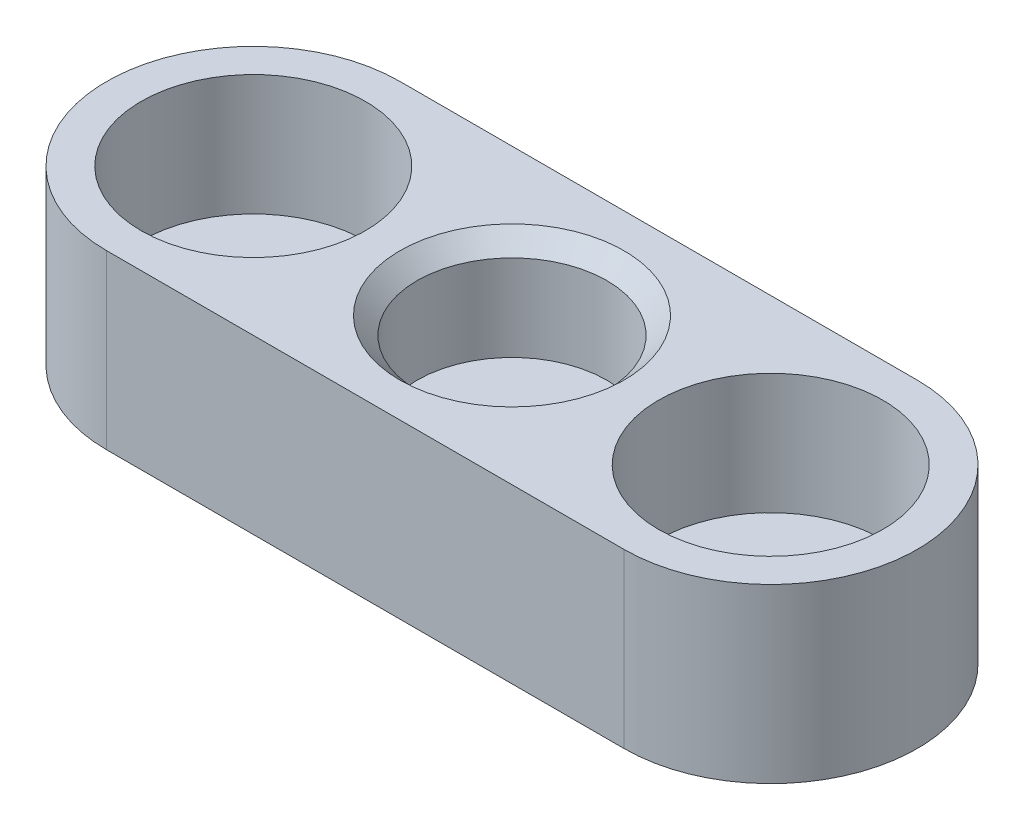
ISO-10303-21;
HEADER;
FILE_DESCRIPTION(('STEP AP214'),'2;1');
FILE_NAME('part.step','',(''),(''),'','','');
FILE_SCHEMA(('AUTOMOTIVE_DESIGN { 1 0 10303 214 1 1 1 1 }'));
ENDSEC;
DATA;
#1=APPLICATION_CONTEXT('core data for automotive mechanical design processes');
#2=APPLICATION_PROTOCOL_DEFINITION('international standard','automotive_design',2000,#1);
#3=PRODUCT_CONTEXT('',#1,'mechanical');
#4=PRODUCT('Part','Part','',(#3));
#5=PRODUCT_RELATED_PRODUCT_CATEGORY('part','',(#4));
#6=PRODUCT_DEFINITION_FORMATION('','',#4);
#7=PRODUCT_DEFINITION_CONTEXT('part definition',#1,'design');
#8=PRODUCT_DEFINITION('design','',#6,#7);
#9=PRODUCT_DEFINITION_SHAPE('','',#8);
#10=(LENGTH_UNIT() NAMED_UNIT(*) SI_UNIT(.MILLI.,.METRE.));
#11=(NAMED_UNIT(*) PLANE_ANGLE_UNIT() SI_UNIT($,.RADIAN.));
#12=(NAMED_UNIT(*) SI_UNIT($,.STERADIAN.) SOLID_ANGLE_UNIT());
#13=UNCERTAINTY_MEASURE_WITH_UNIT(LENGTH_MEASURE(1.E-05),#10,'distance_accuracy_value','');
#14=(GEOMETRIC_REPRESENTATION_CONTEXT(3) GLOBAL_UNCERTAINTY_ASSIGNED_CONTEXT((#13)) GLOBAL_UNIT_ASSIGNED_CONTEXT((#10,
#11,#12)) REPRESENTATION_CONTEXT('',''));
#15=CARTESIAN_POINT('',(0.,0.,0.));
#16=DIRECTION('',(0.,0.,1.));
#17=DIRECTION('',(1.,0.,0.));
#18=AXIS2_PLACEMENT_3D('',#15,#16,#17);
#19=CARTESIAN_POINT('',(7.5,5.,0.));
#20=DIRECTION('',(0.,-1.,0.));
#21=DIRECTION('',(0.,0.,-1.));
#22=AXIS2_PLACEMENT_3D('',#19,#20,#21);
#23=CYLINDRICAL_SURFACE('',#22,4.25);
#24=CARTESIAN_POINT('',(7.5,0.,0.));
#25=DIRECTION('',(0.,1.,0.));
#26=DIRECTION('',(0.,0.,1.));
#27=AXIS2_PLACEMENT_3D('',#24,#25,#26);
#28=CIRCLE('',#27,4.25);
#29=CARTESIAN_POINT('',(7.5,0.,4.25));
#30=VERTEX_POINT('',#29);
#31=CARTESIAN_POINT('',(7.5,0.,-4.25000000000001));
#32=VERTEX_POINT('',#31);
#33=EDGE_CURVE('E128',#30,#32,#28,.T.);
#34=ORIENTED_EDGE('',*,*,#33,.T.);
#35=DIRECTION('',(0.,-1.,0.));
#36=VECTOR('',#35,1.);
#37=CARTESIAN_POINT('',(7.5,5.,-4.25000000000001));
#38=LINE('',#37,#36);
#39=CARTESIAN_POINT('',(7.5,5.,-4.25000000000001));
#40=VERTEX_POINT('',#39);
#41=EDGE_CURVE('E114',#40,#32,#38,.T.);
#42=ORIENTED_EDGE('',*,*,#41,.F.);
#43=CARTESIAN_POINT('',(7.5,5.,0.));
#44=DIRECTION('',(0.,1.,0.));
#45=DIRECTION('',(0.,0.,1.));
#46=AXIS2_PLACEMENT_3D('',#43,#44,#45);
#47=CIRCLE('',#46,4.25);
#48=CARTESIAN_POINT('',(7.5,5.,4.25));
#49=VERTEX_POINT('',#48);
#50=EDGE_CURVE('E106',#49,#40,#47,.T.);
#51=ORIENTED_EDGE('',*,*,#50,.F.);
#52=DIRECTION('',(0.,-1.,0.));
#53=VECTOR('',#52,1.);
#54=CARTESIAN_POINT('',(7.5,5.,4.25));
#55=LINE('',#54,#53);
#56=EDGE_CURVE('E124',#49,#30,#55,.T.);
#57=ORIENTED_EDGE('',*,*,#56,.T.);
#58=EDGE_LOOP('',(#34,#42,#51,#57));
#59=FACE_BOUND('',#58,.T.);
#60=ADVANCED_FACE('F47',(#59),#23,.T.);
#61=CARTESIAN_POINT('',(-7.5,5.,-4.25));
#62=DIRECTION('',(0.,0.,1.));
#63=DIRECTION('',(1.,0.,0.));
#64=AXIS2_PLACEMENT_3D('',#61,#62,#63);
#65=PLANE('',#64);
#66=DIRECTION('',(-1.,0.,0.));
#67=VECTOR('',#66,1.);
#68=CARTESIAN_POINT('',(-7.5,0.,-4.25));
#69=LINE('',#68,#67);
#70=CARTESIAN_POINT('',(-7.5,0.,-4.25));
#71=VERTEX_POINT('',#70);
#72=EDGE_CURVE('E112',#32,#71,#69,.T.);
#73=ORIENTED_EDGE('',*,*,#72,.T.);
#74=DIRECTION('',(0.,-1.,0.));
#75=VECTOR('',#74,1.);
#76=CARTESIAN_POINT('',(-7.5,5.,-4.25));
#77=LINE('',#76,#75);
#78=CARTESIAN_POINT('',(-7.5,5.,-4.25));
#79=VERTEX_POINT('',#78);
#80=EDGE_CURVE('E110',#79,#71,#77,.T.);
#81=ORIENTED_EDGE('',*,*,#80,.F.);
#82=DIRECTION('',(-1.,0.,0.));
#83=VECTOR('',#82,1.);
#84=CARTESIAN_POINT('',(-7.5,5.,-4.25));
#85=LINE('',#84,#83);
#86=EDGE_CURVE('E101',#40,#79,#85,.T.);
#87=ORIENTED_EDGE('',*,*,#86,.F.);
#88=ORIENTED_EDGE('',*,*,#41,.T.);
#89=EDGE_LOOP('',(#73,#81,#87,#88));
#90=FACE_BOUND('',#89,.T.);
#91=ADVANCED_FACE('F111',(#90),#65,.F.);
#92=CARTESIAN_POINT('',(-7.5,5.,0.));
#93=DIRECTION('',(0.,-1.,0.));
#94=DIRECTION('',(0.,0.,-1.));
#95=AXIS2_PLACEMENT_3D('',#92,#93,#94);
#96=CYLINDRICAL_SURFACE('',#95,4.25);
#97=CARTESIAN_POINT('',(-7.5,0.,0.));
#98=DIRECTION('',(0.,1.,0.));
#99=DIRECTION('',(0.,0.,1.));
#100=AXIS2_PLACEMENT_3D('',#97,#98,#99);
#101=CIRCLE('',#100,4.25);
#102=CARTESIAN_POINT('',(-7.5,0.,4.25));
#103=VERTEX_POINT('',#102);
#104=EDGE_CURVE('E86',#71,#103,#101,.T.);
#105=ORIENTED_EDGE('',*,*,#104,.T.);
#106=DIRECTION('',(0.,-1.,0.));
#107=VECTOR('',#106,1.);
#108=CARTESIAN_POINT('',(-7.5,5.,4.25));
#109=LINE('',#108,#107);
#110=CARTESIAN_POINT('',(-7.5,5.,4.25));
#111=VERTEX_POINT('',#110);
#112=EDGE_CURVE('E115',#111,#103,#109,.T.);
#113=ORIENTED_EDGE('',*,*,#112,.F.);
#114=CARTESIAN_POINT('',(-7.5,5.,0.));
#115=DIRECTION('',(0.,1.,0.));
#116=DIRECTION('',(0.,0.,1.));
#117=AXIS2_PLACEMENT_3D('',#114,#115,#116);
#118=CIRCLE('',#117,4.25);
#119=EDGE_CURVE('E104',#79,#111,#118,.T.);
#120=ORIENTED_EDGE('',*,*,#119,.F.);
#121=ORIENTED_EDGE('',*,*,#80,.T.);
#122=EDGE_LOOP('',(#105,#113,#120,#121));
#123=FACE_BOUND('',#122,.T.);
#124=ADVANCED_FACE('F117',(#123),#96,.T.);
#125=CARTESIAN_POINT('',(7.5,5.,4.25));
#126=DIRECTION('',(0.,0.,-1.));
#127=DIRECTION('',(-1.,0.,0.));
#128=AXIS2_PLACEMENT_3D('',#125,#126,#127);
#129=PLANE('',#128);
#130=DIRECTION('',(1.,0.,0.));
#131=VECTOR('',#130,1.);
#132=CARTESIAN_POINT('',(7.5,0.,4.25));
#133=LINE('',#132,#131);
#134=EDGE_CURVE('E93',#103,#30,#133,.T.);
#135=ORIENTED_EDGE('',*,*,#134,.T.);
#136=ORIENTED_EDGE('',*,*,#56,.F.);
#137=DIRECTION('',(1.,0.,0.));
#138=VECTOR('',#137,1.);
#139=CARTESIAN_POINT('',(7.5,5.,4.25));
#140=LINE('',#139,#138);
#141=EDGE_CURVE('E68',#111,#49,#140,.T.);
#142=ORIENTED_EDGE('',*,*,#141,.F.);
#143=ORIENTED_EDGE('',*,*,#112,.T.);
#144=EDGE_LOOP('',(#135,#136,#142,#143));
#145=FACE_BOUND('',#144,.T.);
#146=ADVANCED_FACE('F174',(#145),#129,.F.);
#147=CARTESIAN_POINT('',(7.5,5.,0.));
#148=DIRECTION('',(0.,1.,0.));
#149=DIRECTION('',(0.,0.,1.));
#150=AXIS2_PLACEMENT_3D('',#147,#148,#149);
#151=PLANE('',#150);
#152=CARTESIAN_POINT('',(0.,5.,0.));
#153=DIRECTION('',(0.,1.,0.));
#154=DIRECTION('',(0.,0.,1.));
#155=AXIS2_PLACEMENT_3D('',#152,#153,#154);
#156=CIRCLE('',#155,3.25);
#157=CARTESIAN_POINT('',(0.,5.,3.25));
#158=VERTEX_POINT('',#157);
#159=EDGE_CURVE('E11',#158,#158,#156,.F.);
#160=ORIENTED_EDGE('',*,*,#159,.T.);
#161=EDGE_LOOP('',(#160));
#162=FACE_BOUND('',#161,.T.);
#163=CARTESIAN_POINT('',(-7.5,5.,0.));
#164=DIRECTION('',(0.,1.,0.));
#165=DIRECTION('',(0.,0.,1.));
#166=AXIS2_PLACEMENT_3D('',#163,#164,#165);
#167=CIRCLE('',#166,3.25);
#168=CARTESIAN_POINT('',(-7.5,5.,3.25));
#169=VERTEX_POINT('',#168);
#170=EDGE_CURVE('E217',#169,#169,#167,.T.);
#171=ORIENTED_EDGE('',*,*,#170,.F.);
#172=EDGE_LOOP('',(#171));
#173=FACE_BOUND('',#172,.T.);
#174=CARTESIAN_POINT('',(7.5,5.,0.));
#175=DIRECTION('',(0.,1.,0.));
#176=DIRECTION('',(0.,0.,1.));
#177=AXIS2_PLACEMENT_3D('',#174,#175,#176);
#178=CIRCLE('',#177,3.25);
#179=CARTESIAN_POINT('',(7.5,5.,3.25));
#180=VERTEX_POINT('',#179);
#181=EDGE_CURVE('E230',#180,#180,#178,.T.);
#182=ORIENTED_EDGE('',*,*,#181,.F.);
#183=EDGE_LOOP('',(#182));
#184=FACE_BOUND('',#183,.T.);
#185=ORIENTED_EDGE('',*,*,#50,.T.);
#186=ORIENTED_EDGE('',*,*,#86,.T.);
#187=ORIENTED_EDGE('',*,*,#119,.T.);
#188=ORIENTED_EDGE('',*,*,#141,.T.);
#189=EDGE_LOOP('',(#185,#186,#187,#188));
#190=FACE_BOUND('',#189,.T.);
#191=ADVANCED_FACE('F102',(#162,#173,#184,#190),#151,.T.);
#192=CARTESIAN_POINT('',(7.5,0.,0.));
#193=DIRECTION('',(0.,1.,0.));
#194=DIRECTION('',(0.,0.,1.));
#195=AXIS2_PLACEMENT_3D('',#192,#193,#194);
#196=PLANE('',#195);
#197=CARTESIAN_POINT('',(-7.5,0.,0.));
#198=DIRECTION('',(0.,1.,0.));
#199=DIRECTION('',(0.,0.,1.));
#200=AXIS2_PLACEMENT_3D('',#197,#198,#199);
#201=CIRCLE('',#200,1.7);
#202=CARTESIAN_POINT('',(-7.5,0.,1.7));
#203=VERTEX_POINT('',#202);
#204=EDGE_CURVE('E222',#203,#203,#201,.T.);
#205=ORIENTED_EDGE('',*,*,#204,.T.);
#206=EDGE_LOOP('',(#205));
#207=FACE_BOUND('',#206,.T.);
#208=CARTESIAN_POINT('',(7.5,0.,0.));
#209=DIRECTION('',(0.,1.,0.));
#210=DIRECTION('',(0.,0.,1.));
#211=AXIS2_PLACEMENT_3D('',#208,#209,#210);
#212=CIRCLE('',#211,1.7);
#213=CARTESIAN_POINT('',(7.5,0.,1.7));
#214=VERTEX_POINT('',#213);
#215=EDGE_CURVE('E242',#214,#214,#212,.T.);
#216=ORIENTED_EDGE('',*,*,#215,.T.);
#217=EDGE_LOOP('',(#216));
#218=FACE_BOUND('',#217,.T.);
#219=ORIENTED_EDGE('',*,*,#33,.F.);
#220=ORIENTED_EDGE('',*,*,#134,.F.);
#221=ORIENTED_EDGE('',*,*,#104,.F.);
#222=ORIENTED_EDGE('',*,*,#72,.F.);
#223=EDGE_LOOP('',(#219,#220,#221,#222));
#224=FACE_BOUND('',#223,.T.);
#225=ADVANCED_FACE('F177',(#207,#218,#224),#196,.F.);
#226=CARTESIAN_POINT('',(0.,2.,0.));
#227=DIRECTION('',(0.,1.,0.));
#228=DIRECTION('',(0.,0.,1.));
#229=AXIS2_PLACEMENT_3D('',#226,#227,#228);
#230=CYLINDRICAL_SURFACE('',#229,2.75);
#231=CARTESIAN_POINT('',(0.,4.5,0.));
#232=DIRECTION('',(0.,1.,0.));
#233=DIRECTION('',(0.,0.,1.));
#234=AXIS2_PLACEMENT_3D('',#231,#232,#233);
#235=CIRCLE('',#234,2.75);
#236=CARTESIAN_POINT('',(0.,4.5,2.75));
#237=VERTEX_POINT('',#236);
#238=EDGE_CURVE('E58',#237,#237,#235,.T.);
#239=ORIENTED_EDGE('',*,*,#238,.T.);
#240=EDGE_LOOP('',(#239));
#241=FACE_BOUND('',#240,.T.);
#242=CARTESIAN_POINT('',(0.,2.,0.));
#243=DIRECTION('',(0.,1.,0.));
#244=DIRECTION('',(0.,0.,1.));
#245=AXIS2_PLACEMENT_3D('',#242,#243,#244);
#246=CIRCLE('',#245,2.75);
#247=CARTESIAN_POINT('',(0.,2.,2.75));
#248=VERTEX_POINT('',#247);
#249=EDGE_CURVE('E132',#248,#248,#246,.T.);
#250=ORIENTED_EDGE('',*,*,#249,.F.);
#251=EDGE_LOOP('',(#250));
#252=FACE_BOUND('',#251,.T.);
#253=ADVANCED_FACE('F151',(#241,#252),#230,.F.);
#254=CARTESIAN_POINT('',(0.,2.,0.));
#255=DIRECTION('',(0.,1.,0.));
#256=DIRECTION('',(0.,0.,1.));
#257=AXIS2_PLACEMENT_3D('',#254,#255,#256);
#258=PLANE('',#257);
#259=ORIENTED_EDGE('',*,*,#249,.T.);
#260=EDGE_LOOP('',(#259));
#261=FACE_BOUND('',#260,.T.);
#262=ADVANCED_FACE('F185',(#261),#258,.T.);
#263=CARTESIAN_POINT('',(7.5,5.,0.));
#264=DIRECTION('',(0.,1.,0.));
#265=DIRECTION('',(0.,0.,1.));
#266=AXIS2_PLACEMENT_3D('',#263,#264,#265);
#267=CYLINDRICAL_SURFACE('',#266,1.7);
#268=ORIENTED_EDGE('',*,*,#215,.F.);
#269=EDGE_LOOP('',(#268));
#270=FACE_BOUND('',#269,.T.);
#271=CARTESIAN_POINT('',(7.5,1.5,0.));
#272=DIRECTION('',(0.,1.,0.));
#273=DIRECTION('',(0.,0.,1.));
#274=AXIS2_PLACEMENT_3D('',#271,#272,#273);
#275=CIRCLE('',#274,1.7);
#276=CARTESIAN_POINT('',(7.5,1.5,1.7));
#277=VERTEX_POINT('',#276);
#278=EDGE_CURVE('E238',#277,#277,#275,.T.);
#279=ORIENTED_EDGE('',*,*,#278,.T.);
#280=EDGE_LOOP('',(#279));
#281=FACE_BOUND('',#280,.T.);
#282=ADVANCED_FACE('F188',(#270,#281),#267,.F.);
#283=CARTESIAN_POINT('',(9.2,1.5,0.));
#284=DIRECTION('',(0.,-1.,0.));
#285=DIRECTION('',(0.,0.,-1.));
#286=AXIS2_PLACEMENT_3D('',#283,#284,#285);
#287=PLANE('',#286);
#288=ORIENTED_EDGE('',*,*,#278,.F.);
#289=EDGE_LOOP('',(#288));
#290=FACE_BOUND('',#289,.T.);
#291=CARTESIAN_POINT('',(7.5,1.5,0.));
#292=DIRECTION('',(0.,1.,0.));
#293=DIRECTION('',(0.,0.,1.));
#294=AXIS2_PLACEMENT_3D('',#291,#292,#293);
#295=CIRCLE('',#294,3.25);
#296=CARTESIAN_POINT('',(7.5,1.5,3.25));
#297=VERTEX_POINT('',#296);
#298=EDGE_CURVE('E234',#297,#297,#295,.T.);
#299=ORIENTED_EDGE('',*,*,#298,.T.);
#300=EDGE_LOOP('',(#299));
#301=FACE_BOUND('',#300,.T.);
#302=ADVANCED_FACE('F192',(#290,#301),#287,.F.);
#303=CARTESIAN_POINT('',(7.5,5.,0.));
#304=DIRECTION('',(0.,1.,0.));
#305=DIRECTION('',(0.,0.,1.));
#306=AXIS2_PLACEMENT_3D('',#303,#304,#305);
#307=CYLINDRICAL_SURFACE('',#306,3.25);
#308=ORIENTED_EDGE('',*,*,#298,.F.);
#309=EDGE_LOOP('',(#308));
#310=FACE_BOUND('',#309,.T.);
#311=ORIENTED_EDGE('',*,*,#181,.T.);
#312=EDGE_LOOP('',(#311));
#313=FACE_BOUND('',#312,.T.);
#314=ADVANCED_FACE('F196',(#310,#313),#307,.F.);
#315=CARTESIAN_POINT('',(-7.5,5.,0.));
#316=DIRECTION('',(0.,1.,0.));
#317=DIRECTION('',(0.,0.,1.));
#318=AXIS2_PLACEMENT_3D('',#315,#316,#317);
#319=CYLINDRICAL_SURFACE('',#318,1.7);
#320=ORIENTED_EDGE('',*,*,#204,.F.);
#321=EDGE_LOOP('',(#320));
#322=FACE_BOUND('',#321,.T.);
#323=CARTESIAN_POINT('',(-7.5,1.5,0.));
#324=DIRECTION('',(0.,1.,0.));
#325=DIRECTION('',(0.,0.,1.));
#326=AXIS2_PLACEMENT_3D('',#323,#324,#325);
#327=CIRCLE('',#326,1.7);
#328=CARTESIAN_POINT('',(-7.5,1.5,1.7));
#329=VERTEX_POINT('',#328);
#330=EDGE_CURVE('E212',#329,#329,#327,.T.);
#331=ORIENTED_EDGE('',*,*,#330,.T.);
#332=EDGE_LOOP('',(#331));
#333=FACE_BOUND('',#332,.T.);
#334=ADVANCED_FACE('F200',(#322,#333),#319,.F.);
#335=CARTESIAN_POINT('',(-5.8,1.5,0.));
#336=DIRECTION('',(0.,-1.,0.));
#337=DIRECTION('',(0.,0.,-1.));
#338=AXIS2_PLACEMENT_3D('',#335,#336,#337);
#339=PLANE('',#338);
#340=ORIENTED_EDGE('',*,*,#330,.F.);
#341=EDGE_LOOP('',(#340));
#342=FACE_BOUND('',#341,.T.);
#343=CARTESIAN_POINT('',(-7.5,1.5,0.));
#344=DIRECTION('',(0.,1.,0.));
#345=DIRECTION('',(0.,0.,1.));
#346=AXIS2_PLACEMENT_3D('',#343,#344,#345);
#347=CIRCLE('',#346,3.25);
#348=CARTESIAN_POINT('',(-7.5,1.5,3.25));
#349=VERTEX_POINT('',#348);
#350=EDGE_CURVE('E215',#349,#349,#347,.T.);
#351=ORIENTED_EDGE('',*,*,#350,.T.);
#352=EDGE_LOOP('',(#351));
#353=FACE_BOUND('',#352,.T.);
#354=ADVANCED_FACE('F161',(#342,#353),#339,.F.);
#355=CARTESIAN_POINT('',(-7.5,5.,0.));
#356=DIRECTION('',(0.,1.,0.));
#357=DIRECTION('',(0.,0.,1.));
#358=AXIS2_PLACEMENT_3D('',#355,#356,#357);
#359=CYLINDRICAL_SURFACE('',#358,3.25);
#360=ORIENTED_EDGE('',*,*,#350,.F.);
#361=EDGE_LOOP('',(#360));
#362=FACE_BOUND('',#361,.T.);
#363=ORIENTED_EDGE('',*,*,#170,.T.);
#364=EDGE_LOOP('',(#363));
#365=FACE_BOUND('',#364,.T.);
#366=ADVANCED_FACE('F155',(#362,#365),#359,.F.);
#367=CARTESIAN_POINT('',(0.,4.5,0.));
#368=DIRECTION('',(0.,1.,0.));
#369=DIRECTION('',(0.,0.,1.));
#370=AXIS2_PLACEMENT_3D('',#367,#368,#369);
#371=CONICAL_SURFACE('',#370,2.75,0.785398163397449);
#372=ORIENTED_EDGE('',*,*,#159,.F.);
#373=EDGE_LOOP('',(#372));
#374=FACE_BOUND('',#373,.T.);
#375=ORIENTED_EDGE('',*,*,#238,.F.);
#376=EDGE_LOOP('',(#375));
#377=FACE_BOUND('',#376,.T.);
#378=ADVANCED_FACE('F50',(#374,#377),#371,.F.);
#379=CLOSED_SHELL('',(#60,#91,#124,#146,#191,#225,#253,#262,#282,#302,#314,#334,#354,#366,#378));
#380=MANIFOLD_SOLID_BREP('B2',#379);
#381=ADVANCED_BREP_SHAPE_REPRESENTATION('',(#18,#380),#14);
#382=SHAPE_DEFINITION_REPRESENTATION(#9,#381);
ENDSEC;
END-ISO-10303-21;
